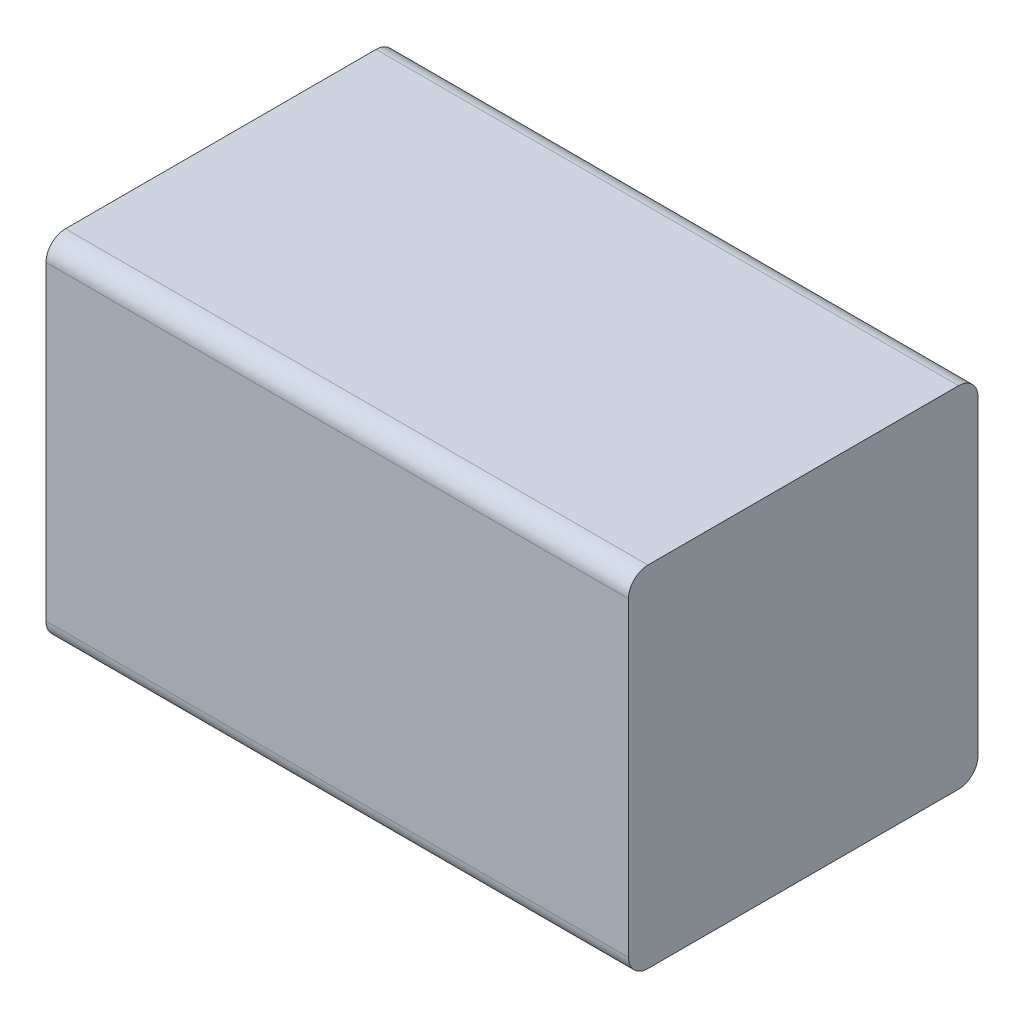
ISO-10303-21;
HEADER;
FILE_DESCRIPTION(('STEP AP214'),'2;1');
FILE_NAME('part.step','',(''),(''),'','','');
FILE_SCHEMA(('AUTOMOTIVE_DESIGN { 1 0 10303 214 1 1 1 1 }'));
ENDSEC;
DATA;
#1=APPLICATION_CONTEXT('core data for automotive mechanical design processes');
#2=APPLICATION_PROTOCOL_DEFINITION('international standard','automotive_design',2000,#1);
#3=PRODUCT_CONTEXT('',#1,'mechanical');
#4=PRODUCT('Part','Part','',(#3));
#5=PRODUCT_RELATED_PRODUCT_CATEGORY('part','',(#4));
#6=PRODUCT_DEFINITION_FORMATION('','',#4);
#7=PRODUCT_DEFINITION_CONTEXT('part definition',#1,'design');
#8=PRODUCT_DEFINITION('design','',#6,#7);
#9=PRODUCT_DEFINITION_SHAPE('','',#8);
#10=(LENGTH_UNIT() NAMED_UNIT(*) SI_UNIT(.MILLI.,.METRE.));
#11=(NAMED_UNIT(*) PLANE_ANGLE_UNIT() SI_UNIT($,.RADIAN.));
#12=(NAMED_UNIT(*) SI_UNIT($,.STERADIAN.) SOLID_ANGLE_UNIT());
#13=UNCERTAINTY_MEASURE_WITH_UNIT(LENGTH_MEASURE(1.E-05),#10,'distance_accuracy_value','');
#14=(GEOMETRIC_REPRESENTATION_CONTEXT(3) GLOBAL_UNCERTAINTY_ASSIGNED_CONTEXT((#13)) GLOBAL_UNIT_ASSIGNED_CONTEXT((#10,
#11,#12)) REPRESENTATION_CONTEXT('',''));
#15=CARTESIAN_POINT('',(0.,0.,0.));
#16=DIRECTION('',(0.,0.,1.));
#17=DIRECTION('',(1.,0.,0.));
#18=AXIS2_PLACEMENT_3D('',#15,#16,#17);
#19=CARTESIAN_POINT('',(0.,0.85,0.05));
#20=DIRECTION('',(1.,0.,0.));
#21=DIRECTION('',(0.,0.,-1.));
#22=AXIS2_PLACEMENT_3D('',#19,#20,#21);
#23=CYLINDRICAL_SURFACE('',#22,0.05);
#24=DIRECTION('',(1.,0.,0.));
#25=VECTOR('',#24,1.);
#26=CARTESIAN_POINT('',(0.,0.85,0.));
#27=LINE('',#26,#25);
#28=CARTESIAN_POINT('',(1.6,0.85,0.));
#29=VERTEX_POINT('',#28);
#30=CARTESIAN_POINT('',(0.1,0.85,0.));
#31=VERTEX_POINT('',#30);
#32=EDGE_CURVE('E82',#29,#31,#27,.F.);
#33=ORIENTED_EDGE('',*,*,#32,.T.);
#34=CARTESIAN_POINT('',(0.1,0.85,0.05));
#35=DIRECTION('',(1.,0.,0.));
#36=DIRECTION('',(0.,0.,-1.));
#37=AXIS2_PLACEMENT_3D('',#34,#35,#36);
#38=CIRCLE('',#37,0.05);
#39=CARTESIAN_POINT('',(0.1,0.9,0.05));
#40=VERTEX_POINT('',#39);
#41=EDGE_CURVE('E87',#31,#40,#38,.T.);
#42=ORIENTED_EDGE('',*,*,#41,.T.);
#43=DIRECTION('',(1.,0.,0.));
#44=VECTOR('',#43,1.);
#45=CARTESIAN_POINT('',(0.,0.9,0.05));
#46=LINE('',#45,#44);
#47=CARTESIAN_POINT('',(1.6,0.9,0.05));
#48=VERTEX_POINT('',#47);
#49=EDGE_CURVE('E85',#48,#40,#46,.F.);
#50=ORIENTED_EDGE('',*,*,#49,.F.);
#51=CARTESIAN_POINT('',(1.6,0.85,0.05));
#52=DIRECTION('',(1.,0.,0.));
#53=DIRECTION('',(0.,0.,-1.));
#54=AXIS2_PLACEMENT_3D('',#51,#52,#53);
#55=CIRCLE('',#54,0.05);
#56=EDGE_CURVE('E20',#48,#29,#55,.F.);
#57=ORIENTED_EDGE('',*,*,#56,.T.);
#58=EDGE_LOOP('',(#33,#42,#50,#57));
#59=FACE_BOUND('',#58,.T.);
#60=ADVANCED_FACE('F17',(#59),#23,.T.);
#61=CARTESIAN_POINT('',(0.,0.85,0.85));
#62=DIRECTION('',(1.,0.,0.));
#63=DIRECTION('',(0.,0.,-1.));
#64=AXIS2_PLACEMENT_3D('',#61,#62,#63);
#65=CYLINDRICAL_SURFACE('',#64,0.05);
#66=DIRECTION('',(1.,0.,0.));
#67=VECTOR('',#66,1.);
#68=CARTESIAN_POINT('',(0.,0.85,0.9));
#69=LINE('',#68,#67);
#70=CARTESIAN_POINT('',(1.6,0.85,0.9));
#71=VERTEX_POINT('',#70);
#72=CARTESIAN_POINT('',(0.1,0.85,0.9));
#73=VERTEX_POINT('',#72);
#74=EDGE_CURVE('E126',#71,#73,#69,.F.);
#75=ORIENTED_EDGE('',*,*,#74,.F.);
#76=CARTESIAN_POINT('',(1.6,0.85,0.85));
#77=DIRECTION('',(1.,0.,0.));
#78=DIRECTION('',(0.,0.,-1.));
#79=AXIS2_PLACEMENT_3D('',#76,#77,#78);
#80=CIRCLE('',#79,0.05);
#81=CARTESIAN_POINT('',(1.6,0.9,0.85));
#82=VERTEX_POINT('',#81);
#83=EDGE_CURVE('E94',#71,#82,#80,.F.);
#84=ORIENTED_EDGE('',*,*,#83,.T.);
#85=DIRECTION('',(1.,0.,0.));
#86=VECTOR('',#85,1.);
#87=CARTESIAN_POINT('',(0.,0.9,0.85));
#88=LINE('',#87,#86);
#89=CARTESIAN_POINT('',(0.1,0.9,0.85));
#90=VERTEX_POINT('',#89);
#91=EDGE_CURVE('E130',#90,#82,#88,.T.);
#92=ORIENTED_EDGE('',*,*,#91,.F.);
#93=CARTESIAN_POINT('',(0.1,0.85,0.85));
#94=DIRECTION('',(1.,0.,0.));
#95=DIRECTION('',(0.,0.,-1.));
#96=AXIS2_PLACEMENT_3D('',#93,#94,#95);
#97=CIRCLE('',#96,0.05);
#98=EDGE_CURVE('E140',#90,#73,#97,.T.);
#99=ORIENTED_EDGE('',*,*,#98,.T.);
#100=EDGE_LOOP('',(#75,#84,#92,#99));
#101=FACE_BOUND('',#100,.T.);
#102=ADVANCED_FACE('F151',(#101),#65,.T.);
#103=CARTESIAN_POINT('',(0.,0.,0.));
#104=DIRECTION('',(0.,0.,1.));
#105=DIRECTION('',(1.,0.,0.));
#106=AXIS2_PLACEMENT_3D('',#103,#104,#105);
#107=PLANE('',#106);
#108=DIRECTION('',(0.,1.,0.));
#109=VECTOR('',#108,1.);
#110=CARTESIAN_POINT('',(1.6,0.,0.));
#111=LINE('',#110,#109);
#112=CARTESIAN_POINT('',(1.6,0.05,0.));
#113=VERTEX_POINT('',#112);
#114=EDGE_CURVE('E91',#113,#29,#111,.T.);
#115=ORIENTED_EDGE('',*,*,#114,.F.);
#116=DIRECTION('',(1.,0.,0.));
#117=VECTOR('',#116,1.);
#118=CARTESIAN_POINT('',(0.,0.05,0.));
#119=LINE('',#118,#117);
#120=CARTESIAN_POINT('',(0.1,0.05,0.));
#121=VERTEX_POINT('',#120);
#122=EDGE_CURVE('E129',#121,#113,#119,.T.);
#123=ORIENTED_EDGE('',*,*,#122,.F.);
#124=DIRECTION('',(0.,1.,0.));
#125=VECTOR('',#124,1.);
#126=CARTESIAN_POINT('',(0.1,0.,0.));
#127=LINE('',#126,#125);
#128=EDGE_CURVE('E93',#121,#31,#127,.T.);
#129=ORIENTED_EDGE('',*,*,#128,.T.);
#130=ORIENTED_EDGE('',*,*,#32,.F.);
#131=EDGE_LOOP('',(#115,#123,#129,#130));
#132=FACE_BOUND('',#131,.T.);
#133=ADVANCED_FACE('F90',(#132),#107,.F.);
#134=CARTESIAN_POINT('',(0.,0.9,0.));
#135=DIRECTION('',(0.,1.,0.));
#136=DIRECTION('',(0.,0.,1.));
#137=AXIS2_PLACEMENT_3D('',#134,#135,#136);
#138=PLANE('',#137);
#139=ORIENTED_EDGE('',*,*,#91,.T.);
#140=DIRECTION('',(0.,0.,-1.));
#141=VECTOR('',#140,1.);
#142=CARTESIAN_POINT('',(1.6,0.9,0.));
#143=LINE('',#142,#141);
#144=EDGE_CURVE('E100',#48,#82,#143,.F.);
#145=ORIENTED_EDGE('',*,*,#144,.F.);
#146=ORIENTED_EDGE('',*,*,#49,.T.);
#147=DIRECTION('',(0.,0.,-1.));
#148=VECTOR('',#147,1.);
#149=CARTESIAN_POINT('',(0.1,0.9,0.));
#150=LINE('',#149,#148);
#151=EDGE_CURVE('E120',#40,#90,#150,.F.);
#152=ORIENTED_EDGE('',*,*,#151,.T.);
#153=EDGE_LOOP('',(#139,#145,#146,#152));
#154=FACE_BOUND('',#153,.T.);
#155=ADVANCED_FACE('F144',(#154),#138,.T.);
#156=CARTESIAN_POINT('',(0.,0.,0.9));
#157=DIRECTION('',(0.,0.,1.));
#158=DIRECTION('',(1.,0.,0.));
#159=AXIS2_PLACEMENT_3D('',#156,#157,#158);
#160=PLANE('',#159);
#161=DIRECTION('',(0.,1.,0.));
#162=VECTOR('',#161,1.);
#163=CARTESIAN_POINT('',(1.6,0.,0.9));
#164=LINE('',#163,#162);
#165=CARTESIAN_POINT('',(1.6,0.05,0.9));
#166=VERTEX_POINT('',#165);
#167=EDGE_CURVE('E102',#71,#166,#164,.F.);
#168=ORIENTED_EDGE('',*,*,#167,.F.);
#169=ORIENTED_EDGE('',*,*,#74,.T.);
#170=DIRECTION('',(0.,1.,0.));
#171=VECTOR('',#170,1.);
#172=CARTESIAN_POINT('',(0.1,0.,0.9));
#173=LINE('',#172,#171);
#174=CARTESIAN_POINT('',(0.1,0.05,0.9));
#175=VERTEX_POINT('',#174);
#176=EDGE_CURVE('E116',#73,#175,#173,.F.);
#177=ORIENTED_EDGE('',*,*,#176,.T.);
#178=DIRECTION('',(1.,0.,0.));
#179=VECTOR('',#178,1.);
#180=CARTESIAN_POINT('',(0.,0.05,0.9));
#181=LINE('',#180,#179);
#182=EDGE_CURVE('E119',#166,#175,#181,.F.);
#183=ORIENTED_EDGE('',*,*,#182,.F.);
#184=EDGE_LOOP('',(#168,#169,#177,#183));
#185=FACE_BOUND('',#184,.T.);
#186=ADVANCED_FACE('F155',(#185),#160,.T.);
#187=CARTESIAN_POINT('',(0.,0.05,0.05));
#188=DIRECTION('',(1.,0.,0.));
#189=DIRECTION('',(0.,0.,-1.));
#190=AXIS2_PLACEMENT_3D('',#187,#188,#189);
#191=CYLINDRICAL_SURFACE('',#190,0.05);
#192=ORIENTED_EDGE('',*,*,#122,.T.);
#193=CARTESIAN_POINT('',(1.6,0.05,0.05));
#194=DIRECTION('',(1.,0.,0.));
#195=DIRECTION('',(0.,0.,-1.));
#196=AXIS2_PLACEMENT_3D('',#193,#194,#195);
#197=CIRCLE('',#196,0.05);
#198=CARTESIAN_POINT('',(1.6,0.,0.05));
#199=VERTEX_POINT('',#198);
#200=EDGE_CURVE('E99',#199,#113,#197,.T.);
#201=ORIENTED_EDGE('',*,*,#200,.F.);
#202=DIRECTION('',(1.,0.,0.));
#203=VECTOR('',#202,1.);
#204=CARTESIAN_POINT('',(0.,0.,0.05));
#205=LINE('',#204,#203);
#206=CARTESIAN_POINT('',(0.1,0.,0.05));
#207=VERTEX_POINT('',#206);
#208=EDGE_CURVE('E111',#199,#207,#205,.F.);
#209=ORIENTED_EDGE('',*,*,#208,.T.);
#210=CARTESIAN_POINT('',(0.1,0.05,0.05));
#211=DIRECTION('',(1.,0.,0.));
#212=DIRECTION('',(0.,0.,-1.));
#213=AXIS2_PLACEMENT_3D('',#210,#211,#212);
#214=CIRCLE('',#213,0.05);
#215=EDGE_CURVE('E124',#207,#121,#214,.T.);
#216=ORIENTED_EDGE('',*,*,#215,.T.);
#217=EDGE_LOOP('',(#192,#201,#209,#216));
#218=FACE_BOUND('',#217,.T.);
#219=ADVANCED_FACE('F163',(#218),#191,.T.);
#220=CARTESIAN_POINT('',(0.1,0.,0.));
#221=DIRECTION('',(1.,0.,0.));
#222=DIRECTION('',(0.,0.,-1.));
#223=AXIS2_PLACEMENT_3D('',#220,#221,#222);
#224=PLANE('',#223);
#225=ORIENTED_EDGE('',*,*,#176,.F.);
#226=ORIENTED_EDGE('',*,*,#98,.F.);
#227=ORIENTED_EDGE('',*,*,#151,.F.);
#228=ORIENTED_EDGE('',*,*,#41,.F.);
#229=ORIENTED_EDGE('',*,*,#128,.F.);
#230=ORIENTED_EDGE('',*,*,#215,.F.);
#231=DIRECTION('',(0.,0.,1.));
#232=VECTOR('',#231,1.);
#233=CARTESIAN_POINT('',(0.1,0.,0.));
#234=LINE('',#233,#232);
#235=CARTESIAN_POINT('',(0.1,0.,0.85));
#236=VERTEX_POINT('',#235);
#237=EDGE_CURVE('E109',#207,#236,#234,.T.);
#238=ORIENTED_EDGE('',*,*,#237,.T.);
#239=CARTESIAN_POINT('',(0.1,0.05,0.85));
#240=DIRECTION('',(1.,0.,0.));
#241=DIRECTION('',(0.,0.,-1.));
#242=AXIS2_PLACEMENT_3D('',#239,#240,#241);
#243=CIRCLE('',#242,0.05);
#244=EDGE_CURVE('E104',#175,#236,#243,.T.);
#245=ORIENTED_EDGE('',*,*,#244,.F.);
#246=EDGE_LOOP('',(#225,#226,#227,#228,#229,#230,#238,#245));
#247=FACE_BOUND('',#246,.T.);
#248=ADVANCED_FACE('F146',(#247),#224,.F.);
#249=CARTESIAN_POINT('',(0.,0.05,0.85));
#250=DIRECTION('',(1.,0.,0.));
#251=DIRECTION('',(0.,0.,-1.));
#252=AXIS2_PLACEMENT_3D('',#249,#250,#251);
#253=CYLINDRICAL_SURFACE('',#252,0.05);
#254=ORIENTED_EDGE('',*,*,#182,.T.);
#255=ORIENTED_EDGE('',*,*,#244,.T.);
#256=DIRECTION('',(1.,0.,0.));
#257=VECTOR('',#256,1.);
#258=CARTESIAN_POINT('',(0.,0.,0.85));
#259=LINE('',#258,#257);
#260=CARTESIAN_POINT('',(1.6,0.,0.85));
#261=VERTEX_POINT('',#260);
#262=EDGE_CURVE('E26',#236,#261,#259,.T.);
#263=ORIENTED_EDGE('',*,*,#262,.T.);
#264=CARTESIAN_POINT('',(1.6,0.05,0.85));
#265=DIRECTION('',(1.,0.,0.));
#266=DIRECTION('',(0.,0.,-1.));
#267=AXIS2_PLACEMENT_3D('',#264,#265,#266);
#268=CIRCLE('',#267,0.05);
#269=EDGE_CURVE('E34',#166,#261,#268,.T.);
#270=ORIENTED_EDGE('',*,*,#269,.F.);
#271=EDGE_LOOP('',(#254,#255,#263,#270));
#272=FACE_BOUND('',#271,.T.);
#273=ADVANCED_FACE('F157',(#272),#253,.T.);
#274=CARTESIAN_POINT('',(1.6,0.,0.));
#275=DIRECTION('',(1.,0.,0.));
#276=DIRECTION('',(0.,0.,-1.));
#277=AXIS2_PLACEMENT_3D('',#274,#275,#276);
#278=PLANE('',#277);
#279=ORIENTED_EDGE('',*,*,#167,.T.);
#280=ORIENTED_EDGE('',*,*,#269,.T.);
#281=DIRECTION('',(0.,0.,1.));
#282=VECTOR('',#281,1.);
#283=CARTESIAN_POINT('',(1.6,0.,0.));
#284=LINE('',#283,#282);
#285=EDGE_CURVE('E11',#261,#199,#284,.F.);
#286=ORIENTED_EDGE('',*,*,#285,.T.);
#287=ORIENTED_EDGE('',*,*,#200,.T.);
#288=ORIENTED_EDGE('',*,*,#114,.T.);
#289=ORIENTED_EDGE('',*,*,#56,.F.);
#290=ORIENTED_EDGE('',*,*,#144,.T.);
#291=ORIENTED_EDGE('',*,*,#83,.F.);
#292=EDGE_LOOP('',(#279,#280,#286,#287,#288,#289,#290,#291));
#293=FACE_BOUND('',#292,.T.);
#294=ADVANCED_FACE('F97',(#293),#278,.T.);
#295=CARTESIAN_POINT('',(0.,0.,0.));
#296=DIRECTION('',(0.,1.,0.));
#297=DIRECTION('',(0.,0.,1.));
#298=AXIS2_PLACEMENT_3D('',#295,#296,#297);
#299=PLANE('',#298);
#300=ORIENTED_EDGE('',*,*,#262,.F.);
#301=ORIENTED_EDGE('',*,*,#237,.F.);
#302=ORIENTED_EDGE('',*,*,#208,.F.);
#303=ORIENTED_EDGE('',*,*,#285,.F.);
#304=EDGE_LOOP('',(#300,#301,#302,#303));
#305=FACE_BOUND('',#304,.T.);
#306=ADVANCED_FACE('F161',(#305),#299,.F.);
#307=CLOSED_SHELL('',(#60,#102,#133,#155,#186,#219,#248,#273,#294,#306));
#308=MANIFOLD_SOLID_BREP('B1',#307);
#309=ADVANCED_BREP_SHAPE_REPRESENTATION('',(#18,#308),#14);
#310=SHAPE_DEFINITION_REPRESENTATION(#9,#309);
ENDSEC;
END-ISO-10303-21;
